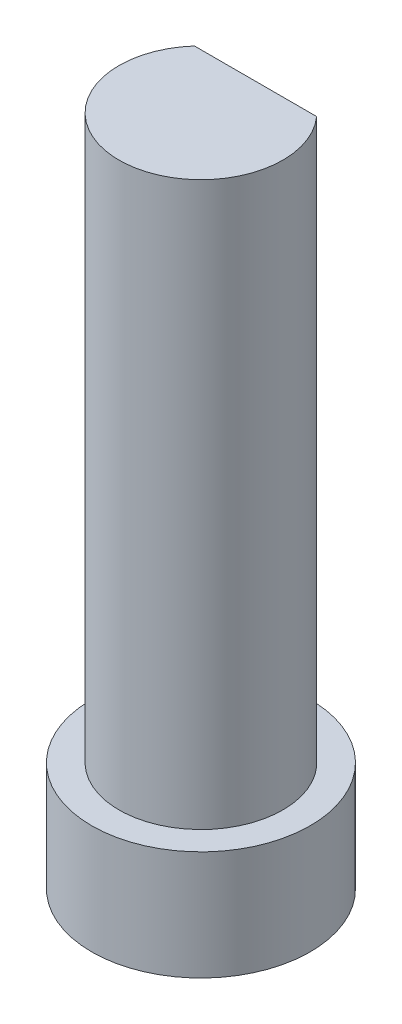
ISO-10303-21;
HEADER;
FILE_DESCRIPTION(('STEP AP214'),'2;1');
FILE_NAME('part.step','',(''),(''),'','','');
FILE_SCHEMA(('AUTOMOTIVE_DESIGN { 1 0 10303 214 1 1 1 1 }'));
ENDSEC;
DATA;
#1=APPLICATION_CONTEXT('core data for automotive mechanical design processes');
#2=APPLICATION_PROTOCOL_DEFINITION('international standard','automotive_design',2000,#1);
#3=PRODUCT_CONTEXT('',#1,'mechanical');
#4=PRODUCT('Part','Part','',(#3));
#5=PRODUCT_RELATED_PRODUCT_CATEGORY('part','',(#4));
#6=PRODUCT_DEFINITION_FORMATION('','',#4);
#7=PRODUCT_DEFINITION_CONTEXT('part definition',#1,'design');
#8=PRODUCT_DEFINITION('design','',#6,#7);
#9=PRODUCT_DEFINITION_SHAPE('','',#8);
#10=(LENGTH_UNIT() NAMED_UNIT(*) SI_UNIT(.MILLI.,.METRE.));
#11=(NAMED_UNIT(*) PLANE_ANGLE_UNIT() SI_UNIT($,.RADIAN.));
#12=(NAMED_UNIT(*) SI_UNIT($,.STERADIAN.) SOLID_ANGLE_UNIT());
#13=UNCERTAINTY_MEASURE_WITH_UNIT(LENGTH_MEASURE(1.E-05),#10,'distance_accuracy_value','');
#14=(GEOMETRIC_REPRESENTATION_CONTEXT(3) GLOBAL_UNCERTAINTY_ASSIGNED_CONTEXT((#13)) GLOBAL_UNIT_ASSIGNED_CONTEXT((#10,
#11,#12)) REPRESENTATION_CONTEXT('',''));
#15=CARTESIAN_POINT('',(0.,0.,0.));
#16=DIRECTION('',(0.,0.,1.));
#17=DIRECTION('',(1.,0.,0.));
#18=AXIS2_PLACEMENT_3D('',#15,#16,#17);
#19=CARTESIAN_POINT('',(0.,12.3,0.));
#20=DIRECTION('',(0.,-1.,0.));
#21=DIRECTION('',(0.,0.,-1.));
#22=AXIS2_PLACEMENT_3D('',#19,#20,#21);
#23=CYLINDRICAL_SURFACE('',#22,1.5);
#24=CARTESIAN_POINT('',(0.,12.3,0.));
#25=DIRECTION('',(0.,1.,0.));
#26=DIRECTION('',(0.,0.,1.));
#27=AXIS2_PLACEMENT_3D('',#24,#25,#26);
#28=CIRCLE('',#27,1.5);
#29=CARTESIAN_POINT('',(-1.1180339887499,12.3,-1.));
#30=VERTEX_POINT('',#29);
#31=CARTESIAN_POINT('',(1.1180339887499,12.3,-1.));
#32=VERTEX_POINT('',#31);
#33=EDGE_CURVE('E12',#30,#32,#28,.T.);
#34=ORIENTED_EDGE('',*,*,#33,.F.);
#35=DIRECTION('',(0.,1.,0.));
#36=VECTOR('',#35,1.);
#37=CARTESIAN_POINT('',(-1.1180339887499,2.,-1.));
#38=LINE('',#37,#36);
#39=CARTESIAN_POINT('',(-1.1180339887499,2.,-1.));
#40=VERTEX_POINT('',#39);
#41=EDGE_CURVE('E68',#40,#30,#38,.T.);
#42=ORIENTED_EDGE('',*,*,#41,.F.);
#43=CARTESIAN_POINT('',(0.,2.,0.));
#44=DIRECTION('',(0.,1.,0.));
#45=DIRECTION('',(0.,0.,1.));
#46=AXIS2_PLACEMENT_3D('',#43,#44,#45);
#47=CIRCLE('',#46,1.5);
#48=CARTESIAN_POINT('',(1.1180339887499,2.,-1.));
#49=VERTEX_POINT('',#48);
#50=EDGE_CURVE('E45',#40,#49,#47,.T.);
#51=ORIENTED_EDGE('',*,*,#50,.T.);
#52=DIRECTION('',(0.,1.,0.));
#53=VECTOR('',#52,1.);
#54=CARTESIAN_POINT('',(1.1180339887499,2.,-1.));
#55=LINE('',#54,#53);
#56=EDGE_CURVE('E56',#49,#32,#55,.T.);
#57=ORIENTED_EDGE('',*,*,#56,.T.);
#58=EDGE_LOOP('',(#34,#42,#51,#57));
#59=FACE_BOUND('',#58,.T.);
#60=ADVANCED_FACE('F42',(#59),#23,.T.);
#61=CARTESIAN_POINT('',(0.,12.3,0.));
#62=DIRECTION('',(0.,1.,0.));
#63=DIRECTION('',(0.,0.,1.));
#64=AXIS2_PLACEMENT_3D('',#61,#62,#63);
#65=PLANE('',#64);
#66=DIRECTION('',(1.,0.,0.));
#67=VECTOR('',#66,1.);
#68=CARTESIAN_POINT('',(0.,12.3,-1.));
#69=LINE('',#68,#67);
#70=EDGE_CURVE('E66',#30,#32,#69,.T.);
#71=ORIENTED_EDGE('',*,*,#70,.F.);
#72=ORIENTED_EDGE('',*,*,#33,.T.);
#73=EDGE_LOOP('',(#71,#72));
#74=FACE_BOUND('',#73,.T.);
#75=ADVANCED_FACE('F76',(#74),#65,.T.);
#76=CARTESIAN_POINT('',(0.,2.,0.));
#77=DIRECTION('',(0.,1.,0.));
#78=DIRECTION('',(0.,0.,1.));
#79=AXIS2_PLACEMENT_3D('',#76,#77,#78);
#80=PLANE('',#79);
#81=ORIENTED_EDGE('',*,*,#50,.F.);
#82=DIRECTION('',(1.,0.,0.));
#83=VECTOR('',#82,1.);
#84=CARTESIAN_POINT('',(0.,2.,-1.));
#85=LINE('',#84,#83);
#86=EDGE_CURVE('E61',#40,#49,#85,.T.);
#87=ORIENTED_EDGE('',*,*,#86,.T.);
#88=EDGE_LOOP('',(#81,#87));
#89=FACE_BOUND('',#88,.T.);
#90=ADVANCED_FACE('F78',(#89),#80,.F.);
#91=CARTESIAN_POINT('',(0.,2.,-1.));
#92=DIRECTION('',(0.,0.,1.));
#93=DIRECTION('',(1.,0.,0.));
#94=AXIS2_PLACEMENT_3D('',#91,#92,#93);
#95=PLANE('',#94);
#96=ORIENTED_EDGE('',*,*,#70,.T.);
#97=ORIENTED_EDGE('',*,*,#56,.F.);
#98=ORIENTED_EDGE('',*,*,#86,.F.);
#99=ORIENTED_EDGE('',*,*,#41,.T.);
#100=EDGE_LOOP('',(#96,#97,#98,#99));
#101=FACE_BOUND('',#100,.T.);
#102=ADVANCED_FACE('F67',(#101),#95,.F.);
#103=CLOSED_SHELL('',(#60,#75,#90,#102));
#104=MANIFOLD_SOLID_BREP('B2',#103);
#105=CARTESIAN_POINT('',(0.,2.,0.));
#106=DIRECTION('',(0.,-1.,0.));
#107=DIRECTION('',(0.,0.,-1.));
#108=AXIS2_PLACEMENT_3D('',#105,#106,#107);
#109=CYLINDRICAL_SURFACE('',#108,2.);
#110=CARTESIAN_POINT('',(0.,2.,0.));
#111=DIRECTION('',(0.,1.,0.));
#112=DIRECTION('',(0.,0.,1.));
#113=AXIS2_PLACEMENT_3D('',#110,#111,#112);
#114=CIRCLE('',#113,2.);
#115=CARTESIAN_POINT('',(0.,2.,2.));
#116=VERTEX_POINT('',#115);
#117=EDGE_CURVE('E41',#116,#116,#114,.T.);
#118=ORIENTED_EDGE('',*,*,#117,.F.);
#119=EDGE_LOOP('',(#118));
#120=FACE_BOUND('',#119,.T.);
#121=CARTESIAN_POINT('',(0.,0.,0.));
#122=DIRECTION('',(0.,1.,0.));
#123=DIRECTION('',(0.,0.,1.));
#124=AXIS2_PLACEMENT_3D('',#121,#122,#123);
#125=CIRCLE('',#124,2.);
#126=CARTESIAN_POINT('',(0.,0.,2.));
#127=VERTEX_POINT('',#126);
#128=EDGE_CURVE('E119',#127,#127,#125,.T.);
#129=ORIENTED_EDGE('',*,*,#128,.T.);
#130=EDGE_LOOP('',(#129));
#131=FACE_BOUND('',#130,.T.);
#132=ADVANCED_FACE('F116',(#120,#131),#109,.T.);
#133=CARTESIAN_POINT('',(0.,2.,0.));
#134=DIRECTION('',(0.,1.,0.));
#135=DIRECTION('',(0.,0.,1.));
#136=AXIS2_PLACEMENT_3D('',#133,#134,#135);
#137=PLANE('',#136);
#138=CARTESIAN_POINT('',(0.,2.,0.));
#139=DIRECTION('',(0.,-1.,0.));
#140=DIRECTION('',(0.,0.,-1.));
#141=AXIS2_PLACEMENT_3D('',#138,#139,#140);
#142=CIRCLE('',#141,0.2);
#143=CARTESIAN_POINT('',(0.,2.,-0.2));
#144=VERTEX_POINT('',#143);
#145=EDGE_CURVE('E126',#144,#144,#142,.T.);
#146=ORIENTED_EDGE('',*,*,#145,.T.);
#147=EDGE_LOOP('',(#146));
#148=FACE_BOUND('',#147,.T.);
#149=ORIENTED_EDGE('',*,*,#117,.T.);
#150=EDGE_LOOP('',(#149));
#151=FACE_BOUND('',#150,.T.);
#152=ADVANCED_FACE('F134',(#148,#151),#137,.T.);
#153=CARTESIAN_POINT('',(0.,0.,0.));
#154=DIRECTION('',(0.,1.,0.));
#155=DIRECTION('',(0.,0.,1.));
#156=AXIS2_PLACEMENT_3D('',#153,#154,#155);
#157=PLANE('',#156);
#158=CARTESIAN_POINT('',(0.,0.,0.));
#159=DIRECTION('',(0.,-1.,0.));
#160=DIRECTION('',(0.,0.,-1.));
#161=AXIS2_PLACEMENT_3D('',#158,#159,#160);
#162=CIRCLE('',#161,0.2);
#163=CARTESIAN_POINT('',(0.,0.,-0.2));
#164=VERTEX_POINT('',#163);
#165=EDGE_CURVE('E128',#164,#164,#162,.T.);
#166=ORIENTED_EDGE('',*,*,#165,.F.);
#167=EDGE_LOOP('',(#166));
#168=FACE_BOUND('',#167,.T.);
#169=ORIENTED_EDGE('',*,*,#128,.F.);
#170=EDGE_LOOP('',(#169));
#171=FACE_BOUND('',#170,.T.);
#172=ADVANCED_FACE('F139',(#168,#171),#157,.F.);
#173=CARTESIAN_POINT('',(0.,2.,0.));
#174=DIRECTION('',(0.,-1.,0.));
#175=DIRECTION('',(0.,0.,-1.));
#176=AXIS2_PLACEMENT_3D('',#173,#174,#175);
#177=CYLINDRICAL_SURFACE('',#176,0.2);
#178=ORIENTED_EDGE('',*,*,#145,.F.);
#179=EDGE_LOOP('',(#178));
#180=FACE_BOUND('',#179,.T.);
#181=ORIENTED_EDGE('',*,*,#165,.T.);
#182=EDGE_LOOP('',(#181));
#183=FACE_BOUND('',#182,.T.);
#184=ADVANCED_FACE('F136',(#180,#183),#177,.F.);
#185=CLOSED_SHELL('',(#132,#152,#172,#184));
#186=MANIFOLD_SOLID_BREP('B6',#185);
#187=ADVANCED_BREP_SHAPE_REPRESENTATION('',(#18,#104,#186),#14);
#188=SHAPE_DEFINITION_REPRESENTATION(#9,#187);
ENDSEC;
END-ISO-10303-21;
